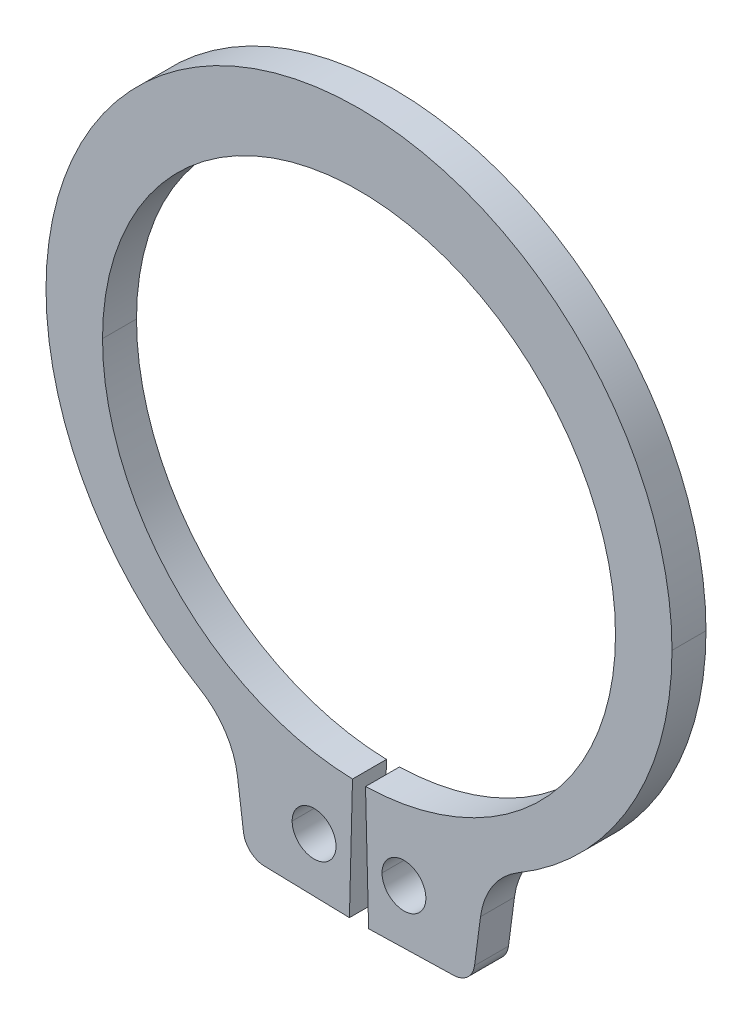
ISO-10303-21;
HEADER;
FILE_DESCRIPTION(('STEP AP214'),'2;1');
FILE_NAME('part.step','',(''),(''),'','','');
FILE_SCHEMA(('AUTOMOTIVE_DESIGN { 1 0 10303 214 1 1 1 1 }'));
ENDSEC;
DATA;
#1=APPLICATION_CONTEXT('core data for automotive mechanical design processes');
#2=APPLICATION_PROTOCOL_DEFINITION('international standard','automotive_design',2000,#1);
#3=PRODUCT_CONTEXT('',#1,'mechanical');
#4=PRODUCT('Part','Part','',(#3));
#5=PRODUCT_RELATED_PRODUCT_CATEGORY('part','',(#4));
#6=PRODUCT_DEFINITION_FORMATION('','',#4);
#7=PRODUCT_DEFINITION_CONTEXT('part definition',#1,'design');
#8=PRODUCT_DEFINITION('design','',#6,#7);
#9=PRODUCT_DEFINITION_SHAPE('','',#8);
#10=(LENGTH_UNIT() NAMED_UNIT(*) SI_UNIT(.MILLI.,.METRE.));
#11=(NAMED_UNIT(*) PLANE_ANGLE_UNIT() SI_UNIT($,.RADIAN.));
#12=(NAMED_UNIT(*) SI_UNIT($,.STERADIAN.) SOLID_ANGLE_UNIT());
#13=UNCERTAINTY_MEASURE_WITH_UNIT(LENGTH_MEASURE(1.E-05),#10,'distance_accuracy_value','');
#14=(GEOMETRIC_REPRESENTATION_CONTEXT(3) GLOBAL_UNCERTAINTY_ASSIGNED_CONTEXT((#13)) GLOBAL_UNIT_ASSIGNED_CONTEXT((#10,
#11,#12)) REPRESENTATION_CONTEXT('',''));
#15=CARTESIAN_POINT('',(0.,0.,0.));
#16=DIRECTION('',(0.,0.,1.));
#17=DIRECTION('',(1.,0.,0.));
#18=AXIS2_PLACEMENT_3D('',#15,#16,#17);
#19=CARTESIAN_POINT('',(1.0414,-7.48439565295689,-0.889));
#20=DIRECTION('',(0.,0.,1.));
#21=DIRECTION('',(1.,0.,0.));
#22=AXIS2_PLACEMENT_3D('',#19,#20,#21);
#23=CYLINDRICAL_SURFACE('',#22,0.508);
#24=CARTESIAN_POINT('',(1.0414,-7.48439565295689,-0.889));
#25=DIRECTION('',(0.,0.,1.));
#26=DIRECTION('',(1.,0.,0.));
#27=AXIS2_PLACEMENT_3D('',#24,#25,#26);
#28=CIRCLE('',#27,0.508);
#29=CARTESIAN_POINT('',(0.5334,-7.48439565295689,-0.889));
#30=VERTEX_POINT('',#29);
#31=CARTESIAN_POINT('',(1.5494,-7.48439565295689,-0.889));
#32=VERTEX_POINT('',#31);
#33=EDGE_CURVE('E41',#30,#32,#28,.T.);
#34=ORIENTED_EDGE('',*,*,#33,.F.);
#35=DIRECTION('',(0.,0.,1.));
#36=VECTOR('',#35,1.);
#37=CARTESIAN_POINT('',(0.5334,-7.48439565295689,-0.889));
#38=LINE('',#37,#36);
#39=CARTESIAN_POINT('',(0.5334,-7.48439565295689,-0.1016));
#40=VERTEX_POINT('',#39);
#41=EDGE_CURVE('E11',#30,#40,#38,.T.);
#42=ORIENTED_EDGE('',*,*,#41,.T.);
#43=CARTESIAN_POINT('',(1.0414,-7.48439565295689,-0.1016));
#44=DIRECTION('',(0.,0.,1.));
#45=DIRECTION('',(1.,0.,0.));
#46=AXIS2_PLACEMENT_3D('',#43,#44,#45);
#47=CIRCLE('',#46,0.508);
#48=CARTESIAN_POINT('',(1.5494,-7.48439565295689,-0.1016));
#49=VERTEX_POINT('',#48);
#50=EDGE_CURVE('E27',#40,#49,#47,.T.);
#51=ORIENTED_EDGE('',*,*,#50,.T.);
#52=DIRECTION('',(0.,0.,1.));
#53=VECTOR('',#52,1.);
#54=CARTESIAN_POINT('',(1.5494,-7.48439565295689,-0.889));
#55=LINE('',#54,#53);
#56=EDGE_CURVE('E332',#32,#49,#55,.T.);
#57=ORIENTED_EDGE('',*,*,#56,.F.);
#58=EDGE_LOOP('',(#34,#42,#51,#57));
#59=FACE_BOUND('',#58,.T.);
#60=ADVANCED_FACE('F16',(#59),#23,.F.);
#61=CARTESIAN_POINT('',(-1.0414,-7.48439565295689,-0.889));
#62=DIRECTION('',(0.,0.,1.));
#63=DIRECTION('',(1.,0.,0.));
#64=AXIS2_PLACEMENT_3D('',#61,#62,#63);
#65=CYLINDRICAL_SURFACE('',#64,0.508);
#66=CARTESIAN_POINT('',(-1.0414,-7.48439565295689,-0.889));
#67=DIRECTION('',(0.,0.,1.));
#68=DIRECTION('',(1.,0.,0.));
#69=AXIS2_PLACEMENT_3D('',#66,#67,#68);
#70=CIRCLE('',#69,0.508);
#71=CARTESIAN_POINT('',(-1.5494,-7.48439565295689,-0.889));
#72=VERTEX_POINT('',#71);
#73=CARTESIAN_POINT('',(-0.5334,-7.48439565295689,-0.889));
#74=VERTEX_POINT('',#73);
#75=EDGE_CURVE('E360',#72,#74,#70,.T.);
#76=ORIENTED_EDGE('',*,*,#75,.F.);
#77=DIRECTION('',(0.,0.,1.));
#78=VECTOR('',#77,1.);
#79=CARTESIAN_POINT('',(-1.5494,-7.48439565295689,-0.889));
#80=LINE('',#79,#78);
#81=CARTESIAN_POINT('',(-1.5494,-7.48439565295689,-0.1016));
#82=VERTEX_POINT('',#81);
#83=EDGE_CURVE('E299',#72,#82,#80,.T.);
#84=ORIENTED_EDGE('',*,*,#83,.T.);
#85=CARTESIAN_POINT('',(-1.0414,-7.48439565295689,-0.1016));
#86=DIRECTION('',(0.,0.,1.));
#87=DIRECTION('',(1.,0.,0.));
#88=AXIS2_PLACEMENT_3D('',#85,#86,#87);
#89=CIRCLE('',#88,0.508);
#90=CARTESIAN_POINT('',(-0.5334,-7.48439565295689,-0.1016));
#91=VERTEX_POINT('',#90);
#92=EDGE_CURVE('E389',#82,#91,#89,.T.);
#93=ORIENTED_EDGE('',*,*,#92,.T.);
#94=DIRECTION('',(0.,0.,1.));
#95=VECTOR('',#94,1.);
#96=CARTESIAN_POINT('',(-0.5334,-7.48439565295689,-0.889));
#97=LINE('',#96,#95);
#98=EDGE_CURVE('E312',#74,#91,#97,.T.);
#99=ORIENTED_EDGE('',*,*,#98,.F.);
#100=EDGE_LOOP('',(#76,#84,#93,#99));
#101=FACE_BOUND('',#100,.T.);
#102=ADVANCED_FACE('F478',(#101),#65,.F.);
#103=CARTESIAN_POINT('',(0.,0.341867412491377,-0.889));
#104=DIRECTION('',(0.,0.,1.));
#105=DIRECTION('',(1.,0.,0.));
#106=AXIS2_PLACEMENT_3D('',#103,#104,#105);
#107=CYLINDRICAL_SURFACE('',#106,7.25273258750863);
#108=CARTESIAN_POINT('',(0.,0.341867412491377,-0.889));
#109=DIRECTION('',(0.,0.,1.));
#110=DIRECTION('',(1.,0.,0.));
#111=AXIS2_PLACEMENT_3D('',#108,#109,#110);
#112=CIRCLE('',#111,7.25273258750863);
#113=CARTESIAN_POINT('',(7.25273258750863,0.341867412491377,-0.889));
#114=VERTEX_POINT('',#113);
#115=CARTESIAN_POINT('',(-7.25273258750863,0.341867412491378,-0.889));
#116=VERTEX_POINT('',#115);
#117=EDGE_CURVE('E385',#114,#116,#112,.T.);
#118=ORIENTED_EDGE('',*,*,#117,.T.);
#119=DIRECTION('',(0.,0.,1.));
#120=VECTOR('',#119,1.);
#121=CARTESIAN_POINT('',(-7.25273258750863,0.341867412491378,-0.889));
#122=LINE('',#121,#120);
#123=CARTESIAN_POINT('',(-7.25273258750863,0.341867412491378,-0.1016));
#124=VERTEX_POINT('',#123);
#125=EDGE_CURVE('E384',#116,#124,#122,.T.);
#126=ORIENTED_EDGE('',*,*,#125,.T.);
#127=CARTESIAN_POINT('',(0.,0.341867412491377,-0.1016));
#128=DIRECTION('',(0.,0.,-1.));
#129=DIRECTION('',(1.,0.,0.));
#130=AXIS2_PLACEMENT_3D('',#127,#128,#129);
#131=CIRCLE('',#130,7.25273258750863);
#132=CARTESIAN_POINT('',(7.25273258750863,0.341867412491377,-0.1016));
#133=VERTEX_POINT('',#132);
#134=EDGE_CURVE('E342',#124,#133,#131,.T.);
#135=ORIENTED_EDGE('',*,*,#134,.T.);
#136=DIRECTION('',(0.,0.,1.));
#137=VECTOR('',#136,1.);
#138=CARTESIAN_POINT('',(7.25273258750863,0.341867412491377,-0.889));
#139=LINE('',#138,#137);
#140=EDGE_CURVE('E227',#114,#133,#139,.T.);
#141=ORIENTED_EDGE('',*,*,#140,.F.);
#142=EDGE_LOOP('',(#118,#126,#135,#141));
#143=FACE_BOUND('',#142,.T.);
#144=ADVANCED_FACE('F483',(#143),#107,.T.);
#145=CARTESIAN_POINT('',(0.,0.341867412491377,-0.889));
#146=DIRECTION('',(0.,0.,1.));
#147=DIRECTION('',(1.,0.,0.));
#148=AXIS2_PLACEMENT_3D('',#145,#146,#147);
#149=CYLINDRICAL_SURFACE('',#148,7.25273258750863);
#150=CARTESIAN_POINT('',(0.,0.341867412491377,-0.889));
#151=DIRECTION('',(0.,0.,1.));
#152=DIRECTION('',(1.,0.,0.));
#153=AXIS2_PLACEMENT_3D('',#150,#151,#152);
#154=CIRCLE('',#153,7.25273258750863);
#155=CARTESIAN_POINT('',(3.68644032392019,-5.90411431371346,-0.889));
#156=VERTEX_POINT('',#155);
#157=EDGE_CURVE('E338',#156,#114,#154,.T.);
#158=ORIENTED_EDGE('',*,*,#157,.T.);
#159=ORIENTED_EDGE('',*,*,#140,.T.);
#160=CARTESIAN_POINT('',(0.,0.341867412491377,-0.1016));
#161=DIRECTION('',(0.,0.,-1.));
#162=DIRECTION('',(1.,0.,0.));
#163=AXIS2_PLACEMENT_3D('',#160,#161,#162);
#164=CIRCLE('',#163,7.25273258750863);
#165=CARTESIAN_POINT('',(3.68644032392019,-5.90411431371346,-0.1016));
#166=VERTEX_POINT('',#165);
#167=EDGE_CURVE('E283',#133,#166,#164,.T.);
#168=ORIENTED_EDGE('',*,*,#167,.T.);
#169=DIRECTION('',(0.,0.,1.));
#170=VECTOR('',#169,1.);
#171=CARTESIAN_POINT('',(3.68644032392019,-5.90411431371346,-0.889));
#172=LINE('',#171,#170);
#173=EDGE_CURVE('E252',#156,#166,#172,.T.);
#174=ORIENTED_EDGE('',*,*,#173,.F.);
#175=EDGE_LOOP('',(#158,#159,#168,#174));
#176=FACE_BOUND('',#175,.T.);
#177=ADVANCED_FACE('F525',(#176),#149,.T.);
#178=CARTESIAN_POINT('',(0.,0.,-0.889));
#179=DIRECTION('',(0.,0.,1.));
#180=DIRECTION('',(1.,0.,0.));
#181=AXIS2_PLACEMENT_3D('',#178,#179,#180);
#182=CYLINDRICAL_SURFACE('',#181,5.9436);
#183=CARTESIAN_POINT('',(0.,0.,-0.889));
#184=DIRECTION('',(0.,0.,-1.));
#185=DIRECTION('',(1.,0.,0.));
#186=AXIS2_PLACEMENT_3D('',#183,#184,#185);
#187=CIRCLE('',#186,5.9436);
#188=CARTESIAN_POINT('',(-0.15074347826087,-5.94168809041352,-0.889));
#189=VERTEX_POINT('',#188);
#190=CARTESIAN_POINT('',(-5.9436,0.,-0.889));
#191=VERTEX_POINT('',#190);
#192=EDGE_CURVE('E239',#189,#191,#187,.T.);
#193=ORIENTED_EDGE('',*,*,#192,.T.);
#194=DIRECTION('',(0.,0.,1.));
#195=VECTOR('',#194,1.);
#196=CARTESIAN_POINT('',(-5.9436,0.,-0.889));
#197=LINE('',#196,#195);
#198=CARTESIAN_POINT('',(-5.9436,0.,-0.1016));
#199=VERTEX_POINT('',#198);
#200=EDGE_CURVE('E235',#191,#199,#197,.T.);
#201=ORIENTED_EDGE('',*,*,#200,.T.);
#202=CARTESIAN_POINT('',(0.,0.,-0.1016));
#203=DIRECTION('',(0.,0.,1.));
#204=DIRECTION('',(1.,0.,0.));
#205=AXIS2_PLACEMENT_3D('',#202,#203,#204);
#206=CIRCLE('',#205,5.9436);
#207=CARTESIAN_POINT('',(-0.15074347826087,-5.94168809041352,-0.1016));
#208=VERTEX_POINT('',#207);
#209=EDGE_CURVE('E240',#199,#208,#206,.T.);
#210=ORIENTED_EDGE('',*,*,#209,.T.);
#211=DIRECTION('',(0.,0.,1.));
#212=VECTOR('',#211,1.);
#213=CARTESIAN_POINT('',(-0.15074347826087,-5.94168809041352,-0.889));
#214=LINE('',#213,#212);
#215=EDGE_CURVE('E287',#189,#208,#214,.T.);
#216=ORIENTED_EDGE('',*,*,#215,.F.);
#217=EDGE_LOOP('',(#193,#201,#210,#216));
#218=FACE_BOUND('',#217,.T.);
#219=ADVANCED_FACE('F512',(#218),#182,.F.);
#220=CARTESIAN_POINT('',(0.,0.,-0.889));
#221=DIRECTION('',(0.,0.,1.));
#222=DIRECTION('',(1.,0.,0.));
#223=AXIS2_PLACEMENT_3D('',#220,#221,#222);
#224=CYLINDRICAL_SURFACE('',#223,5.9436);
#225=ORIENTED_EDGE('',*,*,#200,.F.);
#226=CARTESIAN_POINT('',(0.,0.,-0.889));
#227=DIRECTION('',(0.,0.,-1.));
#228=DIRECTION('',(1.,0.,0.));
#229=AXIS2_PLACEMENT_3D('',#226,#227,#228);
#230=CIRCLE('',#229,5.9436);
#231=CARTESIAN_POINT('',(5.9436,0.,-0.889));
#232=VERTEX_POINT('',#231);
#233=EDGE_CURVE('E269',#191,#232,#230,.T.);
#234=ORIENTED_EDGE('',*,*,#233,.T.);
#235=DIRECTION('',(0.,0.,1.));
#236=VECTOR('',#235,1.);
#237=CARTESIAN_POINT('',(5.9436,0.,-0.889));
#238=LINE('',#237,#236);
#239=CARTESIAN_POINT('',(5.9436,0.,-0.1016));
#240=VERTEX_POINT('',#239);
#241=EDGE_CURVE('E272',#232,#240,#238,.T.);
#242=ORIENTED_EDGE('',*,*,#241,.T.);
#243=CARTESIAN_POINT('',(0.,0.,-0.1016));
#244=DIRECTION('',(0.,0.,1.));
#245=DIRECTION('',(1.,0.,0.));
#246=AXIS2_PLACEMENT_3D('',#243,#244,#245);
#247=CIRCLE('',#246,5.9436);
#248=EDGE_CURVE('E345',#240,#199,#247,.T.);
#249=ORIENTED_EDGE('',*,*,#248,.T.);
#250=EDGE_LOOP('',(#225,#234,#242,#249));
#251=FACE_BOUND('',#250,.T.);
#252=ADVANCED_FACE('F506',(#251),#224,.F.);
#253=CARTESIAN_POINT('',(0.,0.,-0.889));
#254=DIRECTION('',(0.,0.,1.));
#255=DIRECTION('',(1.,0.,0.));
#256=AXIS2_PLACEMENT_3D('',#253,#254,#255);
#257=CYLINDRICAL_SURFACE('',#256,5.9436);
#258=ORIENTED_EDGE('',*,*,#241,.F.);
#259=CARTESIAN_POINT('',(0.,0.,-0.889));
#260=DIRECTION('',(0.,0.,-1.));
#261=DIRECTION('',(1.,0.,0.));
#262=AXIS2_PLACEMENT_3D('',#259,#260,#261);
#263=CIRCLE('',#262,5.9436);
#264=CARTESIAN_POINT('',(0.15074347826087,-5.94168809041352,-0.889));
#265=VERTEX_POINT('',#264);
#266=EDGE_CURVE('E281',#232,#265,#263,.T.);
#267=ORIENTED_EDGE('',*,*,#266,.T.);
#268=DIRECTION('',(0.,0.,1.));
#269=VECTOR('',#268,1.);
#270=CARTESIAN_POINT('',(0.15074347826087,-5.94168809041352,-0.889));
#271=LINE('',#270,#269);
#272=CARTESIAN_POINT('',(0.15074347826087,-5.94168809041352,-0.1016));
#273=VERTEX_POINT('',#272);
#274=EDGE_CURVE('E277',#265,#273,#271,.T.);
#275=ORIENTED_EDGE('',*,*,#274,.T.);
#276=CARTESIAN_POINT('',(0.,0.,-0.1016));
#277=DIRECTION('',(0.,0.,1.));
#278=DIRECTION('',(1.,0.,0.));
#279=AXIS2_PLACEMENT_3D('',#276,#277,#278);
#280=CIRCLE('',#279,5.9436);
#281=EDGE_CURVE('E282',#273,#240,#280,.T.);
#282=ORIENTED_EDGE('',*,*,#281,.T.);
#283=EDGE_LOOP('',(#258,#267,#275,#282));
#284=FACE_BOUND('',#283,.T.);
#285=ADVANCED_FACE('F511',(#284),#257,.F.);
#286=CARTESIAN_POINT('',(-0.15074347826087,-5.94168809041352,-0.889));
#287=DIRECTION('',(0.999678324654,-0.0253623188405797,0.));
#288=DIRECTION('',(0.,0.,-1.));
#289=AXIS2_PLACEMENT_3D('',#286,#287,#288);
#290=PLANE('',#289);
#291=ORIENTED_EDGE('',*,*,#215,.T.);
#292=DIRECTION('',(-0.0253623188405797,-0.999678324654,0.));
#293=VECTOR('',#292,1.);
#294=CARTESIAN_POINT('',(-0.15074347826087,-5.94168809041352,-0.1016));
#295=LINE('',#294,#293);
#296=CARTESIAN_POINT('',(-0.22225,-8.760181158943,-0.1016));
#297=VERTEX_POINT('',#296);
#298=EDGE_CURVE('E290',#208,#297,#295,.T.);
#299=ORIENTED_EDGE('',*,*,#298,.T.);
#300=DIRECTION('',(0.,0.,1.));
#301=VECTOR('',#300,1.);
#302=CARTESIAN_POINT('',(-0.22225,-8.760181158943,-0.889));
#303=LINE('',#302,#301);
#304=CARTESIAN_POINT('',(-0.22225,-8.760181158943,-0.889));
#305=VERTEX_POINT('',#304);
#306=EDGE_CURVE('E355',#305,#297,#303,.T.);
#307=ORIENTED_EDGE('',*,*,#306,.F.);
#308=DIRECTION('',(0.0253623188405797,0.999678324654,0.));
#309=VECTOR('',#308,1.);
#310=CARTESIAN_POINT('',(-0.15074347826087,-5.94168809041352,-0.889));
#311=LINE('',#310,#309);
#312=EDGE_CURVE('E350',#305,#189,#311,.T.);
#313=ORIENTED_EDGE('',*,*,#312,.T.);
#314=EDGE_LOOP('',(#291,#299,#307,#313));
#315=FACE_BOUND('',#314,.T.);
#316=ADVANCED_FACE('F559',(#315),#290,.T.);
#317=CARTESIAN_POINT('',(-0.22225,-8.760181158943,-0.889));
#318=DIRECTION('',(-0.0253623188405812,-0.999678324654,0.));
#319=DIRECTION('',(-0.999678324654,0.0253623188405812,0.));
#320=AXIS2_PLACEMENT_3D('',#317,#318,#319);
#321=PLANE('',#320);
#322=ORIENTED_EDGE('',*,*,#306,.T.);
#323=DIRECTION('',(-0.999678324654,0.0253623188405812,0.));
#324=VECTOR('',#323,1.);
#325=CARTESIAN_POINT('',(-0.22225,-8.760181158943,-0.1016));
#326=LINE('',#325,#324);
#327=CARTESIAN_POINT('',(-2.19350081150534,-8.71016957985485,-0.1016));
#328=VERTEX_POINT('',#327);
#329=EDGE_CURVE('E304',#297,#328,#326,.T.);
#330=ORIENTED_EDGE('',*,*,#329,.T.);
#331=DIRECTION('',(0.,0.,1.));
#332=VECTOR('',#331,1.);
#333=CARTESIAN_POINT('',(-2.19350081150534,-8.71016957985485,-0.889));
#334=LINE('',#333,#332);
#335=CARTESIAN_POINT('',(-2.19350081150534,-8.71016957985485,-0.889));
#336=VERTEX_POINT('',#335);
#337=EDGE_CURVE('E305',#336,#328,#334,.T.);
#338=ORIENTED_EDGE('',*,*,#337,.F.);
#339=DIRECTION('',(0.999678324654,-0.0253623188405812,0.));
#340=VECTOR('',#339,1.);
#341=CARTESIAN_POINT('',(-0.22225,-8.760181158943,-0.889));
#342=LINE('',#341,#340);
#343=EDGE_CURVE('E300',#336,#305,#342,.T.);
#344=ORIENTED_EDGE('',*,*,#343,.T.);
#345=EDGE_LOOP('',(#322,#330,#338,#344));
#346=FACE_BOUND('',#345,.T.);
#347=ADVANCED_FACE('F587',(#346),#321,.T.);
#348=CARTESIAN_POINT('',(-2.18081965208505,-8.21033041752785,-0.889));
#349=DIRECTION('',(0.,0.,1.));
#350=DIRECTION('',(1.,0.,0.));
#351=AXIS2_PLACEMENT_3D('',#348,#349,#350);
#352=CYLINDRICAL_SURFACE('',#351,0.5);
#353=ORIENTED_EDGE('',*,*,#337,.T.);
#354=CARTESIAN_POINT('',(-2.18081965208505,-8.21033041752785,-0.1016));
#355=DIRECTION('',(0.,0.,-1.));
#356=DIRECTION('',(1.,0.,0.));
#357=AXIS2_PLACEMENT_3D('',#354,#355,#356);
#358=CIRCLE('',#357,0.5);
#359=CARTESIAN_POINT('',(-2.67654208277196,-8.27559351363788,-0.1016));
#360=VERTEX_POINT('',#359);
#361=EDGE_CURVE('E308',#328,#360,#358,.T.);
#362=ORIENTED_EDGE('',*,*,#361,.T.);
#363=DIRECTION('',(0.,0.,1.));
#364=VECTOR('',#363,1.);
#365=CARTESIAN_POINT('',(-2.67654208277196,-8.27559351363788,-0.889));
#366=LINE('',#365,#364);
#367=CARTESIAN_POINT('',(-2.67654208277196,-8.27559351363788,-0.889));
#368=VERTEX_POINT('',#367);
#369=EDGE_CURVE('E183',#368,#360,#366,.T.);
#370=ORIENTED_EDGE('',*,*,#369,.F.);
#371=CARTESIAN_POINT('',(-2.18081965208505,-8.21033041752785,-0.889));
#372=DIRECTION('',(0.,0.,1.));
#373=DIRECTION('',(1.,0.,0.));
#374=AXIS2_PLACEMENT_3D('',#371,#372,#373);
#375=CIRCLE('',#374,0.5);
#376=EDGE_CURVE('E248',#368,#336,#375,.T.);
#377=ORIENTED_EDGE('',*,*,#376,.T.);
#378=EDGE_LOOP('',(#353,#362,#370,#377));
#379=FACE_BOUND('',#378,.T.);
#380=ADVANCED_FACE('F457',(#379),#352,.T.);
#381=CARTESIAN_POINT('',(-2.81532005516637,-7.22147015906734,-0.889));
#382=DIRECTION('',(-0.99144486137381,-0.130526192220052,0.));
#383=DIRECTION('',(-0.130526192220052,0.99144486137381,0.));
#384=AXIS2_PLACEMENT_3D('',#381,#382,#383);
#385=PLANE('',#384);
#386=ORIENTED_EDGE('',*,*,#369,.T.);
#387=DIRECTION('',(-0.130526192220052,0.99144486137381,0.));
#388=VECTOR('',#387,1.);
#389=CARTESIAN_POINT('',(-2.81532005516637,-7.22147015906734,-0.1016));
#390=LINE('',#389,#388);
#391=CARTESIAN_POINT('',(-2.81532005516637,-7.22147015906734,-0.1016));
#392=VERTEX_POINT('',#391);
#393=EDGE_CURVE('E207',#360,#392,#390,.T.);
#394=ORIENTED_EDGE('',*,*,#393,.T.);
#395=DIRECTION('',(0.,0.,1.));
#396=VECTOR('',#395,1.);
#397=CARTESIAN_POINT('',(-2.81532005516637,-7.22147015906734,-0.889));
#398=LINE('',#397,#396);
#399=CARTESIAN_POINT('',(-2.81532005516637,-7.22147015906734,-0.889));
#400=VERTEX_POINT('',#399);
#401=EDGE_CURVE('E192',#400,#392,#398,.T.);
#402=ORIENTED_EDGE('',*,*,#401,.F.);
#403=DIRECTION('',(0.130526192220052,-0.99144486137381,0.));
#404=VECTOR('',#403,1.);
#405=CARTESIAN_POINT('',(-2.81532005516637,-7.22147015906734,-0.889));
#406=LINE('',#405,#404);
#407=EDGE_CURVE('E204',#400,#368,#406,.T.);
#408=ORIENTED_EDGE('',*,*,#407,.T.);
#409=EDGE_LOOP('',(#386,#394,#402,#408));
#410=FACE_BOUND('',#409,.T.);
#411=ADVANCED_FACE('F18',(#410),#385,.T.);
#412=CARTESIAN_POINT('',(-4.60285275575283,-7.45680330361869,-0.889));
#413=DIRECTION('',(0.,0.,1.));
#414=DIRECTION('',(1.,0.,0.));
#415=AXIS2_PLACEMENT_3D('',#412,#413,#414);
#416=CYLINDRICAL_SURFACE('',#415,1.80295724979555);
#417=ORIENTED_EDGE('',*,*,#401,.T.);
#418=CARTESIAN_POINT('',(-4.60285275575283,-7.45680330361869,-0.1016));
#419=DIRECTION('',(0.,0.,1.));
#420=DIRECTION('',(1.,0.,0.));
#421=AXIS2_PLACEMENT_3D('',#418,#419,#420);
#422=CIRCLE('',#421,1.80295724979555);
#423=CARTESIAN_POINT('',(-3.68644032392019,-5.90411431371346,-0.1016));
#424=VERTEX_POINT('',#423);
#425=EDGE_CURVE('E196',#392,#424,#422,.T.);
#426=ORIENTED_EDGE('',*,*,#425,.T.);
#427=DIRECTION('',(0.,0.,1.));
#428=VECTOR('',#427,1.);
#429=CARTESIAN_POINT('',(-3.68644032392019,-5.90411431371346,-0.889));
#430=LINE('',#429,#428);
#431=CARTESIAN_POINT('',(-3.68644032392019,-5.90411431371346,-0.889));
#432=VERTEX_POINT('',#431);
#433=EDGE_CURVE('E251',#432,#424,#430,.T.);
#434=ORIENTED_EDGE('',*,*,#433,.F.);
#435=CARTESIAN_POINT('',(-4.60285275575283,-7.45680330361869,-0.889));
#436=DIRECTION('',(0.,0.,-1.));
#437=DIRECTION('',(1.,0.,0.));
#438=AXIS2_PLACEMENT_3D('',#435,#436,#437);
#439=CIRCLE('',#438,1.80295724979555);
#440=EDGE_CURVE('E199',#432,#400,#439,.T.);
#441=ORIENTED_EDGE('',*,*,#440,.T.);
#442=EDGE_LOOP('',(#417,#426,#434,#441));
#443=FACE_BOUND('',#442,.T.);
#444=ADVANCED_FACE('F194',(#443),#416,.F.);
#445=CARTESIAN_POINT('',(0.,0.341867412491377,-0.889));
#446=DIRECTION('',(0.,0.,1.));
#447=DIRECTION('',(1.,0.,0.));
#448=AXIS2_PLACEMENT_3D('',#445,#446,#447);
#449=CYLINDRICAL_SURFACE('',#448,7.25273258750863);
#450=ORIENTED_EDGE('',*,*,#125,.F.);
#451=CARTESIAN_POINT('',(0.,0.341867412491377,-0.889));
#452=DIRECTION('',(0.,0.,1.));
#453=DIRECTION('',(1.,0.,0.));
#454=AXIS2_PLACEMENT_3D('',#451,#452,#453);
#455=CIRCLE('',#454,7.25273258750863);
#456=EDGE_CURVE('E223',#116,#432,#455,.T.);
#457=ORIENTED_EDGE('',*,*,#456,.T.);
#458=ORIENTED_EDGE('',*,*,#433,.T.);
#459=CARTESIAN_POINT('',(0.,0.341867412491377,-0.1016));
#460=DIRECTION('',(0.,0.,-1.));
#461=DIRECTION('',(1.,0.,0.));
#462=AXIS2_PLACEMENT_3D('',#459,#460,#461);
#463=CIRCLE('',#462,7.25273258750863);
#464=EDGE_CURVE('E216',#424,#124,#463,.T.);
#465=ORIENTED_EDGE('',*,*,#464,.T.);
#466=EDGE_LOOP('',(#450,#457,#458,#465));
#467=FACE_BOUND('',#466,.T.);
#468=ADVANCED_FACE('F470',(#467),#449,.T.);
#469=CARTESIAN_POINT('',(4.60285275575283,-7.45680330361869,-0.889));
#470=DIRECTION('',(0.,0.,1.));
#471=DIRECTION('',(1.,0.,0.));
#472=AXIS2_PLACEMENT_3D('',#469,#470,#471);
#473=CYLINDRICAL_SURFACE('',#472,1.80295724979555);
#474=ORIENTED_EDGE('',*,*,#173,.T.);
#475=CARTESIAN_POINT('',(4.60285275575283,-7.45680330361869,-0.1016));
#476=DIRECTION('',(0.,0.,1.));
#477=DIRECTION('',(1.,0.,0.));
#478=AXIS2_PLACEMENT_3D('',#475,#476,#477);
#479=CIRCLE('',#478,1.80295724979555);
#480=CARTESIAN_POINT('',(2.81532005516637,-7.22147015906734,-0.1016));
#481=VERTEX_POINT('',#480);
#482=EDGE_CURVE('E295',#166,#481,#479,.T.);
#483=ORIENTED_EDGE('',*,*,#482,.T.);
#484=DIRECTION('',(0.,0.,1.));
#485=VECTOR('',#484,1.);
#486=CARTESIAN_POINT('',(2.81532005516637,-7.22147015906734,-0.889));
#487=LINE('',#486,#485);
#488=CARTESIAN_POINT('',(2.81532005516637,-7.22147015906734,-0.889));
#489=VERTEX_POINT('',#488);
#490=EDGE_CURVE('E257',#489,#481,#487,.T.);
#491=ORIENTED_EDGE('',*,*,#490,.F.);
#492=CARTESIAN_POINT('',(4.60285275575283,-7.45680330361869,-0.889));
#493=DIRECTION('',(0.,0.,-1.));
#494=DIRECTION('',(1.,0.,0.));
#495=AXIS2_PLACEMENT_3D('',#492,#493,#494);
#496=CIRCLE('',#495,1.80295724979555);
#497=EDGE_CURVE('E291',#489,#156,#496,.T.);
#498=ORIENTED_EDGE('',*,*,#497,.T.);
#499=EDGE_LOOP('',(#474,#483,#491,#498));
#500=FACE_BOUND('',#499,.T.);
#501=ADVANCED_FACE('F408',(#500),#473,.F.);
#502=CARTESIAN_POINT('',(2.81532005516637,-7.22147015906734,-0.889));
#503=DIRECTION('',(0.99144486137381,-0.130526192220052,0.));
#504=DIRECTION('',(0.,0.,-1.));
#505=AXIS2_PLACEMENT_3D('',#502,#503,#504);
#506=PLANE('',#505);
#507=ORIENTED_EDGE('',*,*,#490,.T.);
#508=DIRECTION('',(-0.130526192220052,-0.99144486137381,0.));
#509=VECTOR('',#508,1.);
#510=CARTESIAN_POINT('',(2.81532005516637,-7.22147015906734,-0.1016));
#511=LINE('',#510,#509);
#512=CARTESIAN_POINT('',(2.67654208277196,-8.27559351363788,-0.1016));
#513=VERTEX_POINT('',#512);
#514=EDGE_CURVE('E253',#481,#513,#511,.T.);
#515=ORIENTED_EDGE('',*,*,#514,.T.);
#516=DIRECTION('',(0.,0.,1.));
#517=VECTOR('',#516,1.);
#518=CARTESIAN_POINT('',(2.67654208277196,-8.27559351363788,-0.889));
#519=LINE('',#518,#517);
#520=CARTESIAN_POINT('',(2.67654208277196,-8.27559351363788,-0.889));
#521=VERTEX_POINT('',#520);
#522=EDGE_CURVE('E266',#521,#513,#519,.T.);
#523=ORIENTED_EDGE('',*,*,#522,.F.);
#524=DIRECTION('',(0.130526192220052,0.99144486137381,0.));
#525=VECTOR('',#524,1.);
#526=CARTESIAN_POINT('',(2.81532005516637,-7.22147015906734,-0.889));
#527=LINE('',#526,#525);
#528=EDGE_CURVE('E258',#521,#489,#527,.T.);
#529=ORIENTED_EDGE('',*,*,#528,.T.);
#530=EDGE_LOOP('',(#507,#515,#523,#529));
#531=FACE_BOUND('',#530,.T.);
#532=ADVANCED_FACE('F401',(#531),#506,.T.);
#533=CARTESIAN_POINT('',(2.18081965208505,-8.21033041752785,-0.889));
#534=DIRECTION('',(0.,0.,1.));
#535=DIRECTION('',(1.,0.,0.));
#536=AXIS2_PLACEMENT_3D('',#533,#534,#535);
#537=CYLINDRICAL_SURFACE('',#536,0.5);
#538=ORIENTED_EDGE('',*,*,#522,.T.);
#539=CARTESIAN_POINT('',(2.18081965208505,-8.21033041752785,-0.1016));
#540=DIRECTION('',(0.,0.,-1.));
#541=DIRECTION('',(1.,0.,0.));
#542=AXIS2_PLACEMENT_3D('',#539,#540,#541);
#543=CIRCLE('',#542,0.5);
#544=CARTESIAN_POINT('',(2.19350081150534,-8.71016957985485,-0.1016));
#545=VERTEX_POINT('',#544);
#546=EDGE_CURVE('E262',#513,#545,#543,.T.);
#547=ORIENTED_EDGE('',*,*,#546,.T.);
#548=DIRECTION('',(0.,0.,1.));
#549=VECTOR('',#548,1.);
#550=CARTESIAN_POINT('',(2.19350081150534,-8.71016957985485,-0.889));
#551=LINE('',#550,#549);
#552=CARTESIAN_POINT('',(2.19350081150534,-8.71016957985485,-0.889));
#553=VERTEX_POINT('',#552);
#554=EDGE_CURVE('E233',#553,#545,#551,.T.);
#555=ORIENTED_EDGE('',*,*,#554,.F.);
#556=CARTESIAN_POINT('',(2.18081965208505,-8.21033041752785,-0.889));
#557=DIRECTION('',(0.,0.,1.));
#558=DIRECTION('',(-1.,0.,0.));
#559=AXIS2_PLACEMENT_3D('',#556,#557,#558);
#560=CIRCLE('',#559,0.5);
#561=EDGE_CURVE('E261',#553,#521,#560,.T.);
#562=ORIENTED_EDGE('',*,*,#561,.T.);
#563=EDGE_LOOP('',(#538,#547,#555,#562));
#564=FACE_BOUND('',#563,.T.);
#565=ADVANCED_FACE('F414',(#564),#537,.T.);
#566=CARTESIAN_POINT('',(0.22225,-8.760181158943,-0.889));
#567=DIRECTION('',(0.0253623188405812,-0.999678324654,0.));
#568=DIRECTION('',(0.,0.,-1.));
#569=AXIS2_PLACEMENT_3D('',#566,#567,#568);
#570=PLANE('',#569);
#571=ORIENTED_EDGE('',*,*,#554,.T.);
#572=DIRECTION('',(-0.999678324654,-0.0253623188405812,0.));
#573=VECTOR('',#572,1.);
#574=CARTESIAN_POINT('',(0.22225,-8.760181158943,-0.1016));
#575=LINE('',#574,#573);
#576=CARTESIAN_POINT('',(0.22225,-8.760181158943,-0.1016));
#577=VERTEX_POINT('',#576);
#578=EDGE_CURVE('E229',#545,#577,#575,.T.);
#579=ORIENTED_EDGE('',*,*,#578,.T.);
#580=DIRECTION('',(0.,0.,1.));
#581=VECTOR('',#580,1.);
#582=CARTESIAN_POINT('',(0.22225,-8.760181158943,-0.889));
#583=LINE('',#582,#581);
#584=CARTESIAN_POINT('',(0.22225,-8.760181158943,-0.889));
#585=VERTEX_POINT('',#584);
#586=EDGE_CURVE('E241',#585,#577,#583,.T.);
#587=ORIENTED_EDGE('',*,*,#586,.F.);
#588=DIRECTION('',(0.999678324654,0.0253623188405812,0.));
#589=VECTOR('',#588,1.);
#590=CARTESIAN_POINT('',(0.22225,-8.760181158943,-0.889));
#591=LINE('',#590,#589);
#592=EDGE_CURVE('E234',#585,#553,#591,.T.);
#593=ORIENTED_EDGE('',*,*,#592,.T.);
#594=EDGE_LOOP('',(#571,#579,#587,#593));
#595=FACE_BOUND('',#594,.T.);
#596=ADVANCED_FACE('F534',(#595),#570,.T.);
#597=CARTESIAN_POINT('',(0.15074347826087,-5.94168809041352,-0.889));
#598=DIRECTION('',(-0.999678324654,-0.0253623188405797,0.));
#599=DIRECTION('',(-0.0253623188405797,0.999678324654,0.));
#600=AXIS2_PLACEMENT_3D('',#597,#598,#599);
#601=PLANE('',#600);
#602=ORIENTED_EDGE('',*,*,#586,.T.);
#603=DIRECTION('',(-0.0253623188405797,0.999678324654,0.));
#604=VECTOR('',#603,1.);
#605=CARTESIAN_POINT('',(0.15074347826087,-5.94168809041352,-0.1016));
#606=LINE('',#605,#604);
#607=EDGE_CURVE('E245',#577,#273,#606,.T.);
#608=ORIENTED_EDGE('',*,*,#607,.T.);
#609=ORIENTED_EDGE('',*,*,#274,.F.);
#610=DIRECTION('',(0.0253623188405797,-0.999678324654,0.));
#611=VECTOR('',#610,1.);
#612=CARTESIAN_POINT('',(0.15074347826087,-5.94168809041352,-0.889));
#613=LINE('',#612,#611);
#614=EDGE_CURVE('E327',#265,#585,#613,.T.);
#615=ORIENTED_EDGE('',*,*,#614,.T.);
#616=EDGE_LOOP('',(#602,#608,#609,#615));
#617=FACE_BOUND('',#616,.T.);
#618=ADVANCED_FACE('F497',(#617),#601,.T.);
#619=CARTESIAN_POINT('',(0.,0.,-0.889));
#620=DIRECTION('',(0.,0.,1.));
#621=DIRECTION('',(1.,0.,0.));
#622=AXIS2_PLACEMENT_3D('',#619,#620,#621);
#623=PLANE('',#622);
#624=ORIENTED_EDGE('',*,*,#192,.F.);
#625=ORIENTED_EDGE('',*,*,#312,.F.);
#626=ORIENTED_EDGE('',*,*,#343,.F.);
#627=ORIENTED_EDGE('',*,*,#376,.F.);
#628=ORIENTED_EDGE('',*,*,#407,.F.);
#629=ORIENTED_EDGE('',*,*,#440,.F.);
#630=ORIENTED_EDGE('',*,*,#456,.F.);
#631=ORIENTED_EDGE('',*,*,#117,.F.);
#632=ORIENTED_EDGE('',*,*,#157,.F.);
#633=ORIENTED_EDGE('',*,*,#497,.F.);
#634=ORIENTED_EDGE('',*,*,#528,.F.);
#635=ORIENTED_EDGE('',*,*,#561,.F.);
#636=ORIENTED_EDGE('',*,*,#592,.F.);
#637=ORIENTED_EDGE('',*,*,#614,.F.);
#638=ORIENTED_EDGE('',*,*,#266,.F.);
#639=ORIENTED_EDGE('',*,*,#233,.F.);
#640=EDGE_LOOP('',(#624,#625,#626,#627,#628,#629,#630,#631,#632,#633,#634,#635,#636,#637,#638,#639));
#641=FACE_BOUND('',#640,.T.);
#642=CARTESIAN_POINT('',(-1.0414,-7.48439565295689,-0.889));
#643=DIRECTION('',(0.,0.,1.));
#644=DIRECTION('',(1.,0.,0.));
#645=AXIS2_PLACEMENT_3D('',#642,#643,#644);
#646=CIRCLE('',#645,0.508);
#647=EDGE_CURVE('E354',#74,#72,#646,.T.);
#648=ORIENTED_EDGE('',*,*,#647,.T.);
#649=ORIENTED_EDGE('',*,*,#75,.T.);
#650=EDGE_LOOP('',(#648,#649));
#651=FACE_BOUND('',#650,.T.);
#652=CARTESIAN_POINT('',(1.0414,-7.48439565295689,-0.889));
#653=DIRECTION('',(0.,0.,1.));
#654=DIRECTION('',(1.,0.,0.));
#655=AXIS2_PLACEMENT_3D('',#652,#653,#654);
#656=CIRCLE('',#655,0.508);
#657=EDGE_CURVE('E311',#32,#30,#656,.T.);
#658=ORIENTED_EDGE('',*,*,#657,.T.);
#659=ORIENTED_EDGE('',*,*,#33,.T.);
#660=EDGE_LOOP('',(#658,#659));
#661=FACE_BOUND('',#660,.T.);
#662=ADVANCED_FACE('F419',(#641,#651,#661),#623,.F.);
#663=CARTESIAN_POINT('',(0.,0.,-0.1016));
#664=DIRECTION('',(0.,0.,1.));
#665=DIRECTION('',(1.,0.,0.));
#666=AXIS2_PLACEMENT_3D('',#663,#664,#665);
#667=PLANE('',#666);
#668=ORIENTED_EDGE('',*,*,#607,.F.);
#669=ORIENTED_EDGE('',*,*,#578,.F.);
#670=ORIENTED_EDGE('',*,*,#546,.F.);
#671=ORIENTED_EDGE('',*,*,#514,.F.);
#672=ORIENTED_EDGE('',*,*,#482,.F.);
#673=ORIENTED_EDGE('',*,*,#167,.F.);
#674=ORIENTED_EDGE('',*,*,#134,.F.);
#675=ORIENTED_EDGE('',*,*,#464,.F.);
#676=ORIENTED_EDGE('',*,*,#425,.F.);
#677=ORIENTED_EDGE('',*,*,#393,.F.);
#678=ORIENTED_EDGE('',*,*,#361,.F.);
#679=ORIENTED_EDGE('',*,*,#329,.F.);
#680=ORIENTED_EDGE('',*,*,#298,.F.);
#681=ORIENTED_EDGE('',*,*,#209,.F.);
#682=ORIENTED_EDGE('',*,*,#248,.F.);
#683=ORIENTED_EDGE('',*,*,#281,.F.);
#684=EDGE_LOOP('',(#668,#669,#670,#671,#672,#673,#674,#675,#676,#677,#678,#679,#680,#681,#682,#683));
#685=FACE_BOUND('',#684,.T.);
#686=CARTESIAN_POINT('',(-1.0414,-7.48439565295689,-0.1016));
#687=DIRECTION('',(0.,0.,1.));
#688=DIRECTION('',(1.,0.,0.));
#689=AXIS2_PLACEMENT_3D('',#686,#687,#688);
#690=CIRCLE('',#689,0.508);
#691=EDGE_CURVE('E328',#91,#82,#690,.T.);
#692=ORIENTED_EDGE('',*,*,#691,.F.);
#693=ORIENTED_EDGE('',*,*,#92,.F.);
#694=EDGE_LOOP('',(#692,#693));
#695=FACE_BOUND('',#694,.T.);
#696=CARTESIAN_POINT('',(1.0414,-7.48439565295689,-0.1016));
#697=DIRECTION('',(0.,0.,1.));
#698=DIRECTION('',(1.,0.,0.));
#699=AXIS2_PLACEMENT_3D('',#696,#697,#698);
#700=CIRCLE('',#699,0.508);
#701=EDGE_CURVE('E20',#49,#40,#700,.T.);
#702=ORIENTED_EDGE('',*,*,#701,.F.);
#703=ORIENTED_EDGE('',*,*,#50,.F.);
#704=EDGE_LOOP('',(#702,#703));
#705=FACE_BOUND('',#704,.T.);
#706=ADVANCED_FACE('F213',(#685,#695,#705),#667,.T.);
#707=CARTESIAN_POINT('',(-1.0414,-7.48439565295689,-0.889));
#708=DIRECTION('',(0.,0.,1.));
#709=DIRECTION('',(1.,0.,0.));
#710=AXIS2_PLACEMENT_3D('',#707,#708,#709);
#711=CYLINDRICAL_SURFACE('',#710,0.508);
#712=ORIENTED_EDGE('',*,*,#83,.F.);
#713=ORIENTED_EDGE('',*,*,#647,.F.);
#714=ORIENTED_EDGE('',*,*,#98,.T.);
#715=ORIENTED_EDGE('',*,*,#691,.T.);
#716=EDGE_LOOP('',(#712,#713,#714,#715));
#717=FACE_BOUND('',#716,.T.);
#718=ADVANCED_FACE('F640',(#717),#711,.F.);
#719=CARTESIAN_POINT('',(1.0414,-7.48439565295689,-0.889));
#720=DIRECTION('',(0.,0.,1.));
#721=DIRECTION('',(1.,0.,0.));
#722=AXIS2_PLACEMENT_3D('',#719,#720,#721);
#723=CYLINDRICAL_SURFACE('',#722,0.508);
#724=ORIENTED_EDGE('',*,*,#41,.F.);
#725=ORIENTED_EDGE('',*,*,#657,.F.);
#726=ORIENTED_EDGE('',*,*,#56,.T.);
#727=ORIENTED_EDGE('',*,*,#701,.T.);
#728=EDGE_LOOP('',(#724,#725,#726,#727));
#729=FACE_BOUND('',#728,.T.);
#730=ADVANCED_FACE('F667',(#729),#723,.F.);
#731=CLOSED_SHELL('',(#60,#102,#144,#177,#219,#252,#285,#316,#347,#380,#411,#444,#468,#501,#532,
#565,#596,#618,#662,#706,#718,#730));
#732=MANIFOLD_SOLID_BREP('B1',#731);
#733=ADVANCED_BREP_SHAPE_REPRESENTATION('',(#18,#732),#14);
#734=SHAPE_DEFINITION_REPRESENTATION(#9,#733);
ENDSEC;
END-ISO-10303-21;
